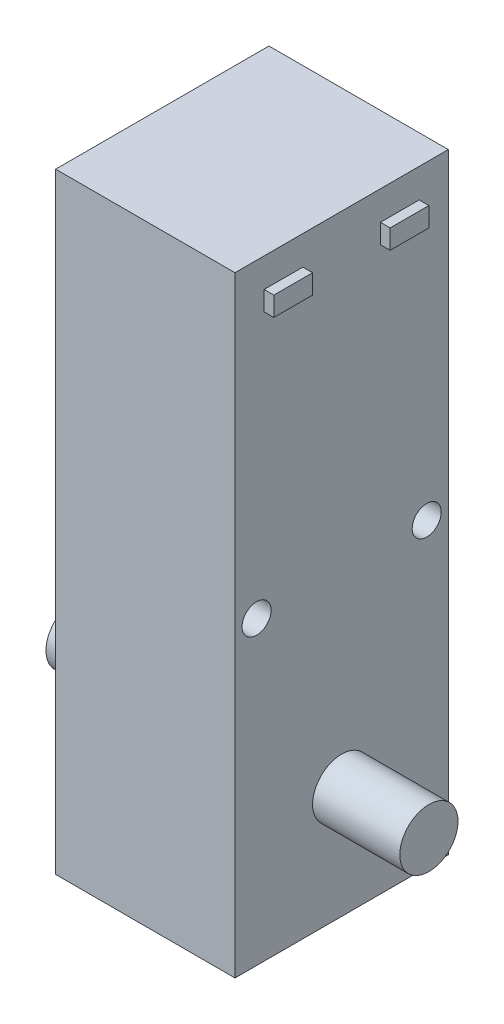
ISO-10303-21;
HEADER;
FILE_DESCRIPTION(('STEP AP214'),'2;1');
FILE_NAME('part.step','',(''),(''),'','','');
FILE_SCHEMA(('AUTOMOTIVE_DESIGN { 1 0 10303 214 1 1 1 1 }'));
ENDSEC;
DATA;
#1=APPLICATION_CONTEXT('core data for automotive mechanical design processes');
#2=APPLICATION_PROTOCOL_DEFINITION('international standard','automotive_design',2000,#1);
#3=PRODUCT_CONTEXT('',#1,'mechanical');
#4=PRODUCT('Part','Part','',(#3));
#5=PRODUCT_RELATED_PRODUCT_CATEGORY('part','',(#4));
#6=PRODUCT_DEFINITION_FORMATION('','',#4);
#7=PRODUCT_DEFINITION_CONTEXT('part definition',#1,'design');
#8=PRODUCT_DEFINITION('design','',#6,#7);
#9=PRODUCT_DEFINITION_SHAPE('','',#8);
#10=(LENGTH_UNIT() NAMED_UNIT(*) SI_UNIT(.MILLI.,.METRE.));
#11=(NAMED_UNIT(*) PLANE_ANGLE_UNIT() SI_UNIT($,.RADIAN.));
#12=(NAMED_UNIT(*) SI_UNIT($,.STERADIAN.) SOLID_ANGLE_UNIT());
#13=UNCERTAINTY_MEASURE_WITH_UNIT(LENGTH_MEASURE(1.E-05),#10,'distance_accuracy_value','');
#14=(GEOMETRIC_REPRESENTATION_CONTEXT(3) GLOBAL_UNCERTAINTY_ASSIGNED_CONTEXT((#13)) GLOBAL_UNIT_ASSIGNED_CONTEXT((#10,
#11,#12)) REPRESENTATION_CONTEXT('',''));
#15=CARTESIAN_POINT('',(0.,0.,0.));
#16=DIRECTION('',(0.,0.,1.));
#17=DIRECTION('',(1.,0.,0.));
#18=AXIS2_PLACEMENT_3D('',#15,#16,#17);
#19=CARTESIAN_POINT('',(18.5,0.,0.));
#20=DIRECTION('',(-1.,0.,0.));
#21=DIRECTION('',(0.,0.,1.));
#22=AXIS2_PLACEMENT_3D('',#19,#20,#21);
#23=PLANE('',#22);
#24=DIRECTION('',(0.,-1.,0.));
#25=VECTOR('',#24,1.);
#26=CARTESIAN_POINT('',(18.5,60.,-3.));
#27=LINE('',#26,#25);
#28=CARTESIAN_POINT('',(18.5,60.,-3.));
#29=VERTEX_POINT('',#28);
#30=CARTESIAN_POINT('',(18.5,58.,-3.));
#31=VERTEX_POINT('',#30);
#32=EDGE_CURVE('E143',#29,#31,#27,.T.);
#33=ORIENTED_EDGE('',*,*,#32,.F.);
#34=DIRECTION('',(0.,0.,1.));
#35=VECTOR('',#34,1.);
#36=CARTESIAN_POINT('',(18.5,60.,-3.));
#37=LINE('',#36,#35);
#38=CARTESIAN_POINT('',(18.5,60.,-7.));
#39=VERTEX_POINT('',#38);
#40=EDGE_CURVE('E156',#39,#29,#37,.T.);
#41=ORIENTED_EDGE('',*,*,#40,.F.);
#42=DIRECTION('',(0.,1.,0.));
#43=VECTOR('',#42,1.);
#44=CARTESIAN_POINT('',(18.5,60.,-7.));
#45=LINE('',#44,#43);
#46=CARTESIAN_POINT('',(18.5,58.,-7.));
#47=VERTEX_POINT('',#46);
#48=EDGE_CURVE('E165',#47,#39,#45,.T.);
#49=ORIENTED_EDGE('',*,*,#48,.F.);
#50=DIRECTION('',(0.,0.,-1.));
#51=VECTOR('',#50,1.);
#52=CARTESIAN_POINT('',(18.5,58.,-3.));
#53=LINE('',#52,#51);
#54=EDGE_CURVE('E146',#31,#47,#53,.T.);
#55=ORIENTED_EDGE('',*,*,#54,.F.);
#56=EDGE_LOOP('',(#33,#41,#49,#55));
#57=FACE_BOUND('',#56,.T.);
#58=CARTESIAN_POINT('',(18.5,11.5,-11.));
#59=DIRECTION('',(-1.,0.,0.));
#60=DIRECTION('',(0.,0.,1.));
#61=AXIS2_PLACEMENT_3D('',#58,#59,#60);
#62=CIRCLE('',#61,3.);
#63=CARTESIAN_POINT('',(18.5,11.5,-8.00000000000001));
#64=VERTEX_POINT('',#63);
#65=EDGE_CURVE('E187',#64,#64,#62,.T.);
#66=ORIENTED_EDGE('',*,*,#65,.T.);
#67=EDGE_LOOP('',(#66));
#68=FACE_BOUND('',#67,.T.);
#69=DIRECTION('',(0.,-1.,0.));
#70=VECTOR('',#69,1.);
#71=CARTESIAN_POINT('',(18.5,0.,0.));
#72=LINE('',#71,#70);
#73=CARTESIAN_POINT('',(18.5,63.,0.));
#74=VERTEX_POINT('',#73);
#75=CARTESIAN_POINT('',(18.5,0.,0.));
#76=VERTEX_POINT('',#75);
#77=EDGE_CURVE('E203',#74,#76,#72,.T.);
#78=ORIENTED_EDGE('',*,*,#77,.T.);
#79=DIRECTION('',(0.,0.,-1.));
#80=VECTOR('',#79,1.);
#81=CARTESIAN_POINT('',(18.5,0.,0.));
#82=LINE('',#81,#80);
#83=CARTESIAN_POINT('',(18.5,0.,-22.));
#84=VERTEX_POINT('',#83);
#85=EDGE_CURVE('E206',#76,#84,#82,.T.);
#86=ORIENTED_EDGE('',*,*,#85,.T.);
#87=DIRECTION('',(0.,1.,0.));
#88=VECTOR('',#87,1.);
#89=CARTESIAN_POINT('',(18.5,0.,-22.));
#90=LINE('',#89,#88);
#91=CARTESIAN_POINT('',(18.5,63.,-22.));
#92=VERTEX_POINT('',#91);
#93=EDGE_CURVE('E209',#84,#92,#90,.T.);
#94=ORIENTED_EDGE('',*,*,#93,.T.);
#95=DIRECTION('',(0.,0.,1.));
#96=VECTOR('',#95,1.);
#97=CARTESIAN_POINT('',(18.5,63.,0.));
#98=LINE('',#97,#96);
#99=EDGE_CURVE('E211',#92,#74,#98,.T.);
#100=ORIENTED_EDGE('',*,*,#99,.T.);
#101=EDGE_LOOP('',(#78,#86,#94,#100));
#102=FACE_BOUND('',#101,.T.);
#103=CARTESIAN_POINT('',(18.5,31.,-2.225));
#104=DIRECTION('',(1.,0.,0.));
#105=DIRECTION('',(0.,0.,-1.));
#106=AXIS2_PLACEMENT_3D('',#103,#104,#105);
#107=CIRCLE('',#106,1.5);
#108=CARTESIAN_POINT('',(18.5,31.,-3.725));
#109=VERTEX_POINT('',#108);
#110=EDGE_CURVE('E197',#109,#109,#107,.T.);
#111=ORIENTED_EDGE('',*,*,#110,.F.);
#112=EDGE_LOOP('',(#111));
#113=FACE_BOUND('',#112,.T.);
#114=CARTESIAN_POINT('',(18.5,31.,-19.775));
#115=DIRECTION('',(1.,0.,0.));
#116=DIRECTION('',(0.,0.,1.));
#117=AXIS2_PLACEMENT_3D('',#114,#115,#116);
#118=CIRCLE('',#117,1.5);
#119=CARTESIAN_POINT('',(18.5,31.,-18.275));
#120=VERTEX_POINT('',#119);
#121=EDGE_CURVE('E191',#120,#120,#118,.T.);
#122=ORIENTED_EDGE('',*,*,#121,.F.);
#123=EDGE_LOOP('',(#122));
#124=FACE_BOUND('',#123,.T.);
#125=DIRECTION('',(0.,1.,0.));
#126=VECTOR('',#125,1.);
#127=CARTESIAN_POINT('',(18.5,60.,-19.));
#128=LINE('',#127,#126);
#129=CARTESIAN_POINT('',(18.5,58.,-19.));
#130=VERTEX_POINT('',#129);
#131=CARTESIAN_POINT('',(18.5,60.,-19.));
#132=VERTEX_POINT('',#131);
#133=EDGE_CURVE('E142',#130,#132,#128,.T.);
#134=ORIENTED_EDGE('',*,*,#133,.F.);
#135=DIRECTION('',(0.,0.,-1.));
#136=VECTOR('',#135,1.);
#137=CARTESIAN_POINT('',(18.5,58.,-19.));
#138=LINE('',#137,#136);
#139=CARTESIAN_POINT('',(18.5,58.,-15.));
#140=VERTEX_POINT('',#139);
#141=EDGE_CURVE('E139',#140,#130,#138,.T.);
#142=ORIENTED_EDGE('',*,*,#141,.F.);
#143=DIRECTION('',(0.,-1.,0.));
#144=VECTOR('',#143,1.);
#145=CARTESIAN_POINT('',(18.5,60.,-15.));
#146=LINE('',#145,#144);
#147=CARTESIAN_POINT('',(18.5,60.,-15.));
#148=VERTEX_POINT('',#147);
#149=EDGE_CURVE('E53',#148,#140,#146,.T.);
#150=ORIENTED_EDGE('',*,*,#149,.F.);
#151=DIRECTION('',(0.,0.,1.));
#152=VECTOR('',#151,1.);
#153=CARTESIAN_POINT('',(18.5,60.,-19.));
#154=LINE('',#153,#152);
#155=EDGE_CURVE('E48',#132,#148,#154,.T.);
#156=ORIENTED_EDGE('',*,*,#155,.F.);
#157=EDGE_LOOP('',(#134,#142,#150,#156));
#158=FACE_BOUND('',#157,.T.);
#159=ADVANCED_FACE('F33',(#57,#68,#102,#113,#124,#158),#23,.F.);
#160=CARTESIAN_POINT('',(0.,0.,0.));
#161=DIRECTION('',(-1.,0.,0.));
#162=DIRECTION('',(0.,0.,1.));
#163=AXIS2_PLACEMENT_3D('',#160,#161,#162);
#164=PLANE('',#163);
#165=CARTESIAN_POINT('',(0.,11.5,-11.));
#166=DIRECTION('',(-1.,0.,0.));
#167=DIRECTION('',(0.,0.,1.));
#168=AXIS2_PLACEMENT_3D('',#165,#166,#167);
#169=CIRCLE('',#168,3.);
#170=CARTESIAN_POINT('',(0.,11.5,-8.00000000000001));
#171=VERTEX_POINT('',#170);
#172=EDGE_CURVE('E11',#171,#171,#169,.T.);
#173=ORIENTED_EDGE('',*,*,#172,.F.);
#174=EDGE_LOOP('',(#173));
#175=FACE_BOUND('',#174,.T.);
#176=CARTESIAN_POINT('',(0.,31.,-2.225));
#177=DIRECTION('',(1.,0.,0.));
#178=DIRECTION('',(0.,0.,-1.));
#179=AXIS2_PLACEMENT_3D('',#176,#177,#178);
#180=CIRCLE('',#179,1.5);
#181=CARTESIAN_POINT('',(0.,31.,-3.725));
#182=VERTEX_POINT('',#181);
#183=EDGE_CURVE('E194',#182,#182,#180,.T.);
#184=ORIENTED_EDGE('',*,*,#183,.T.);
#185=EDGE_LOOP('',(#184));
#186=FACE_BOUND('',#185,.T.);
#187=DIRECTION('',(0.,-1.,0.));
#188=VECTOR('',#187,1.);
#189=CARTESIAN_POINT('',(0.,0.,0.));
#190=LINE('',#189,#188);
#191=CARTESIAN_POINT('',(0.,63.,0.));
#192=VERTEX_POINT('',#191);
#193=CARTESIAN_POINT('',(0.,0.,0.));
#194=VERTEX_POINT('',#193);
#195=EDGE_CURVE('E200',#192,#194,#190,.T.);
#196=ORIENTED_EDGE('',*,*,#195,.F.);
#197=DIRECTION('',(0.,0.,1.));
#198=VECTOR('',#197,1.);
#199=CARTESIAN_POINT('',(0.,63.,0.));
#200=LINE('',#199,#198);
#201=CARTESIAN_POINT('',(0.,63.,-22.));
#202=VERTEX_POINT('',#201);
#203=EDGE_CURVE('E207',#202,#192,#200,.T.);
#204=ORIENTED_EDGE('',*,*,#203,.F.);
#205=DIRECTION('',(0.,1.,0.));
#206=VECTOR('',#205,1.);
#207=CARTESIAN_POINT('',(0.,0.,-22.));
#208=LINE('',#207,#206);
#209=CARTESIAN_POINT('',(0.,0.,-22.));
#210=VERTEX_POINT('',#209);
#211=EDGE_CURVE('E218',#210,#202,#208,.T.);
#212=ORIENTED_EDGE('',*,*,#211,.F.);
#213=DIRECTION('',(0.,0.,-1.));
#214=VECTOR('',#213,1.);
#215=CARTESIAN_POINT('',(0.,0.,0.));
#216=LINE('',#215,#214);
#217=EDGE_CURVE('E216',#194,#210,#216,.T.);
#218=ORIENTED_EDGE('',*,*,#217,.F.);
#219=EDGE_LOOP('',(#196,#204,#212,#218));
#220=FACE_BOUND('',#219,.T.);
#221=CARTESIAN_POINT('',(0.,31.,-19.775));
#222=DIRECTION('',(1.,0.,0.));
#223=DIRECTION('',(0.,0.,1.));
#224=AXIS2_PLACEMENT_3D('',#221,#222,#223);
#225=CIRCLE('',#224,1.5);
#226=CARTESIAN_POINT('',(0.,31.,-18.275));
#227=VERTEX_POINT('',#226);
#228=EDGE_CURVE('E190',#227,#227,#225,.T.);
#229=ORIENTED_EDGE('',*,*,#228,.T.);
#230=EDGE_LOOP('',(#229));
#231=FACE_BOUND('',#230,.T.);
#232=ADVANCED_FACE('F239',(#175,#186,#220,#231),#164,.T.);
#233=CARTESIAN_POINT('',(18.5,0.,0.));
#234=DIRECTION('',(0.,0.,-1.));
#235=DIRECTION('',(-1.,0.,0.));
#236=AXIS2_PLACEMENT_3D('',#233,#234,#235);
#237=PLANE('',#236);
#238=ORIENTED_EDGE('',*,*,#195,.T.);
#239=DIRECTION('',(-1.,0.,0.));
#240=VECTOR('',#239,1.);
#241=CARTESIAN_POINT('',(18.5,0.,0.));
#242=LINE('',#241,#240);
#243=EDGE_CURVE('E41',#76,#194,#242,.T.);
#244=ORIENTED_EDGE('',*,*,#243,.F.);
#245=ORIENTED_EDGE('',*,*,#77,.F.);
#246=DIRECTION('',(-1.,0.,0.));
#247=VECTOR('',#246,1.);
#248=CARTESIAN_POINT('',(18.5,63.,0.));
#249=LINE('',#248,#247);
#250=EDGE_CURVE('E213',#74,#192,#249,.T.);
#251=ORIENTED_EDGE('',*,*,#250,.T.);
#252=EDGE_LOOP('',(#238,#244,#245,#251));
#253=FACE_BOUND('',#252,.T.);
#254=ADVANCED_FACE('F35',(#253),#237,.F.);
#255=CARTESIAN_POINT('',(18.5,0.,0.));
#256=DIRECTION('',(0.,1.,0.));
#257=DIRECTION('',(0.,0.,1.));
#258=AXIS2_PLACEMENT_3D('',#255,#256,#257);
#259=PLANE('',#258);
#260=ORIENTED_EDGE('',*,*,#217,.T.);
#261=DIRECTION('',(-1.,0.,0.));
#262=VECTOR('',#261,1.);
#263=CARTESIAN_POINT('',(18.5,0.,-22.));
#264=LINE('',#263,#262);
#265=EDGE_CURVE('E226',#84,#210,#264,.T.);
#266=ORIENTED_EDGE('',*,*,#265,.F.);
#267=ORIENTED_EDGE('',*,*,#85,.F.);
#268=ORIENTED_EDGE('',*,*,#243,.T.);
#269=EDGE_LOOP('',(#260,#266,#267,#268));
#270=FACE_BOUND('',#269,.T.);
#271=ADVANCED_FACE('F231',(#270),#259,.F.);
#272=CARTESIAN_POINT('',(18.5,0.,-22.));
#273=DIRECTION('',(0.,0.,1.));
#274=DIRECTION('',(1.,0.,0.));
#275=AXIS2_PLACEMENT_3D('',#272,#273,#274);
#276=PLANE('',#275);
#277=ORIENTED_EDGE('',*,*,#211,.T.);
#278=DIRECTION('',(-1.,0.,0.));
#279=VECTOR('',#278,1.);
#280=CARTESIAN_POINT('',(18.5,63.,-22.));
#281=LINE('',#280,#279);
#282=EDGE_CURVE('E223',#92,#202,#281,.T.);
#283=ORIENTED_EDGE('',*,*,#282,.F.);
#284=ORIENTED_EDGE('',*,*,#93,.F.);
#285=ORIENTED_EDGE('',*,*,#265,.T.);
#286=EDGE_LOOP('',(#277,#283,#284,#285));
#287=FACE_BOUND('',#286,.T.);
#288=ADVANCED_FACE('F244',(#287),#276,.F.);
#289=CARTESIAN_POINT('',(18.5,63.,0.));
#290=DIRECTION('',(0.,-1.,0.));
#291=DIRECTION('',(0.,0.,-1.));
#292=AXIS2_PLACEMENT_3D('',#289,#290,#291);
#293=PLANE('',#292);
#294=ORIENTED_EDGE('',*,*,#203,.T.);
#295=ORIENTED_EDGE('',*,*,#250,.F.);
#296=ORIENTED_EDGE('',*,*,#99,.F.);
#297=ORIENTED_EDGE('',*,*,#282,.T.);
#298=EDGE_LOOP('',(#294,#295,#296,#297));
#299=FACE_BOUND('',#298,.T.);
#300=ADVANCED_FACE('F248',(#299),#293,.F.);
#301=CARTESIAN_POINT('',(18.5,31.,-2.225));
#302=DIRECTION('',(-1.,0.,0.));
#303=DIRECTION('',(0.,0.,1.));
#304=AXIS2_PLACEMENT_3D('',#301,#302,#303);
#305=CYLINDRICAL_SURFACE('',#304,1.5);
#306=ORIENTED_EDGE('',*,*,#110,.T.);
#307=EDGE_LOOP('',(#306));
#308=FACE_BOUND('',#307,.T.);
#309=ORIENTED_EDGE('',*,*,#183,.F.);
#310=EDGE_LOOP('',(#309));
#311=FACE_BOUND('',#310,.T.);
#312=ADVANCED_FACE('F320',(#308,#311),#305,.F.);
#313=CARTESIAN_POINT('',(18.5,31.,-19.775));
#314=DIRECTION('',(-1.,0.,0.));
#315=DIRECTION('',(0.,0.,1.));
#316=AXIS2_PLACEMENT_3D('',#313,#314,#315);
#317=CYLINDRICAL_SURFACE('',#316,1.5);
#318=ORIENTED_EDGE('',*,*,#121,.T.);
#319=EDGE_LOOP('',(#318));
#320=FACE_BOUND('',#319,.T.);
#321=ORIENTED_EDGE('',*,*,#228,.F.);
#322=EDGE_LOOP('',(#321));
#323=FACE_BOUND('',#322,.T.);
#324=ADVANCED_FACE('F313',(#320,#323),#317,.F.);
#325=CARTESIAN_POINT('',(-9.,11.5,-11.));
#326=DIRECTION('',(1.,0.,0.));
#327=DIRECTION('',(0.,0.,-1.));
#328=AXIS2_PLACEMENT_3D('',#325,#326,#327);
#329=PLANE('',#328);
#330=CARTESIAN_POINT('',(-9.,11.5,-11.));
#331=DIRECTION('',(1.,0.,0.));
#332=DIRECTION('',(0.,0.,-1.));
#333=AXIS2_PLACEMENT_3D('',#330,#331,#332);
#334=CIRCLE('',#333,3.);
#335=CARTESIAN_POINT('',(-9.,11.5,-14.));
#336=VERTEX_POINT('',#335);
#337=EDGE_CURVE('E184',#336,#336,#334,.T.);
#338=ORIENTED_EDGE('',*,*,#337,.F.);
#339=EDGE_LOOP('',(#338));
#340=FACE_BOUND('',#339,.T.);
#341=ADVANCED_FACE('F309',(#340),#329,.F.);
#342=CARTESIAN_POINT('',(-9.,11.5,-11.));
#343=DIRECTION('',(1.,0.,0.));
#344=DIRECTION('',(0.,0.,-1.));
#345=AXIS2_PLACEMENT_3D('',#342,#343,#344);
#346=CYLINDRICAL_SURFACE('',#345,3.);
#347=ORIENTED_EDGE('',*,*,#172,.T.);
#348=EDGE_LOOP('',(#347));
#349=FACE_BOUND('',#348,.T.);
#350=ORIENTED_EDGE('',*,*,#337,.T.);
#351=EDGE_LOOP('',(#350));
#352=FACE_BOUND('',#351,.T.);
#353=ADVANCED_FACE('F312',(#349,#352),#346,.T.);
#354=CARTESIAN_POINT('',(27.5,11.5,-11.));
#355=DIRECTION('',(1.,0.,0.));
#356=DIRECTION('',(0.,0.,-1.));
#357=AXIS2_PLACEMENT_3D('',#354,#355,#356);
#358=CIRCLE('',#357,3.);
#359=CARTESIAN_POINT('',(27.5,11.5,-14.));
#360=VERTEX_POINT('',#359);
#361=EDGE_CURVE('E181',#360,#360,#358,.T.);
#362=ORIENTED_EDGE('',*,*,#361,.F.);
#363=EDGE_LOOP('',(#362));
#364=FACE_BOUND('',#363,.T.);
#365=ORIENTED_EDGE('',*,*,#65,.F.);
#366=EDGE_LOOP('',(#365));
#367=FACE_BOUND('',#366,.T.);
#368=ADVANCED_FACE('F307',(#364,#367),#346,.T.);
#369=CARTESIAN_POINT('',(27.5,11.5,-11.));
#370=DIRECTION('',(1.,0.,0.));
#371=DIRECTION('',(0.,0.,-1.));
#372=AXIS2_PLACEMENT_3D('',#369,#370,#371);
#373=PLANE('',#372);
#374=ORIENTED_EDGE('',*,*,#361,.T.);
#375=EDGE_LOOP('',(#374));
#376=FACE_BOUND('',#375,.T.);
#377=ADVANCED_FACE('F303',(#376),#373,.T.);
#378=CARTESIAN_POINT('',(19.5,60.,-3.));
#379=DIRECTION('',(0.,0.,-1.));
#380=DIRECTION('',(0.,1.,0.));
#381=AXIS2_PLACEMENT_3D('',#378,#379,#380);
#382=PLANE('',#381);
#383=ORIENTED_EDGE('',*,*,#32,.T.);
#384=DIRECTION('',(-1.,0.,0.));
#385=VECTOR('',#384,1.);
#386=CARTESIAN_POINT('',(19.5,58.,-3.));
#387=LINE('',#386,#385);
#388=CARTESIAN_POINT('',(19.5,58.,-3.));
#389=VERTEX_POINT('',#388);
#390=EDGE_CURVE('E178',#389,#31,#387,.T.);
#391=ORIENTED_EDGE('',*,*,#390,.F.);
#392=DIRECTION('',(0.,-1.,0.));
#393=VECTOR('',#392,1.);
#394=CARTESIAN_POINT('',(19.5,60.,-3.));
#395=LINE('',#394,#393);
#396=CARTESIAN_POINT('',(19.5,60.,-3.));
#397=VERTEX_POINT('',#396);
#398=EDGE_CURVE('E152',#397,#389,#395,.T.);
#399=ORIENTED_EDGE('',*,*,#398,.F.);
#400=DIRECTION('',(-1.,0.,0.));
#401=VECTOR('',#400,1.);
#402=CARTESIAN_POINT('',(19.5,60.,-3.));
#403=LINE('',#402,#401);
#404=EDGE_CURVE('E161',#397,#29,#403,.T.);
#405=ORIENTED_EDGE('',*,*,#404,.T.);
#406=EDGE_LOOP('',(#383,#391,#399,#405));
#407=FACE_BOUND('',#406,.T.);
#408=ADVANCED_FACE('F299',(#407),#382,.F.);
#409=CARTESIAN_POINT('',(19.5,58.,-3.));
#410=DIRECTION('',(0.,1.,0.));
#411=DIRECTION('',(0.,0.,1.));
#412=AXIS2_PLACEMENT_3D('',#409,#410,#411);
#413=PLANE('',#412);
#414=ORIENTED_EDGE('',*,*,#54,.T.);
#415=DIRECTION('',(-1.,0.,0.));
#416=VECTOR('',#415,1.);
#417=CARTESIAN_POINT('',(19.5,58.,-7.));
#418=LINE('',#417,#416);
#419=CARTESIAN_POINT('',(19.5,58.,-7.));
#420=VERTEX_POINT('',#419);
#421=EDGE_CURVE('E175',#420,#47,#418,.T.);
#422=ORIENTED_EDGE('',*,*,#421,.F.);
#423=DIRECTION('',(0.,0.,-1.));
#424=VECTOR('',#423,1.);
#425=CARTESIAN_POINT('',(19.5,58.,-3.));
#426=LINE('',#425,#424);
#427=EDGE_CURVE('E155',#389,#420,#426,.T.);
#428=ORIENTED_EDGE('',*,*,#427,.F.);
#429=ORIENTED_EDGE('',*,*,#390,.T.);
#430=EDGE_LOOP('',(#414,#422,#428,#429));
#431=FACE_BOUND('',#430,.T.);
#432=ADVANCED_FACE('F295',(#431),#413,.F.);
#433=CARTESIAN_POINT('',(19.5,60.,-7.));
#434=DIRECTION('',(0.,0.,1.));
#435=DIRECTION('',(1.,0.,0.));
#436=AXIS2_PLACEMENT_3D('',#433,#434,#435);
#437=PLANE('',#436);
#438=ORIENTED_EDGE('',*,*,#48,.T.);
#439=DIRECTION('',(-1.,0.,0.));
#440=VECTOR('',#439,1.);
#441=CARTESIAN_POINT('',(19.5,60.,-7.));
#442=LINE('',#441,#440);
#443=CARTESIAN_POINT('',(19.5,60.,-7.));
#444=VERTEX_POINT('',#443);
#445=EDGE_CURVE('E172',#444,#39,#442,.T.);
#446=ORIENTED_EDGE('',*,*,#445,.F.);
#447=DIRECTION('',(0.,1.,0.));
#448=VECTOR('',#447,1.);
#449=CARTESIAN_POINT('',(19.5,60.,-7.));
#450=LINE('',#449,#448);
#451=EDGE_CURVE('E158',#420,#444,#450,.T.);
#452=ORIENTED_EDGE('',*,*,#451,.F.);
#453=ORIENTED_EDGE('',*,*,#421,.T.);
#454=EDGE_LOOP('',(#438,#446,#452,#453));
#455=FACE_BOUND('',#454,.T.);
#456=ADVANCED_FACE('F291',(#455),#437,.F.);
#457=CARTESIAN_POINT('',(19.5,60.,-3.));
#458=DIRECTION('',(0.,-1.,0.));
#459=DIRECTION('',(0.,0.,-1.));
#460=AXIS2_PLACEMENT_3D('',#457,#458,#459);
#461=PLANE('',#460);
#462=ORIENTED_EDGE('',*,*,#40,.T.);
#463=ORIENTED_EDGE('',*,*,#404,.F.);
#464=DIRECTION('',(0.,0.,1.));
#465=VECTOR('',#464,1.);
#466=CARTESIAN_POINT('',(19.5,60.,-3.));
#467=LINE('',#466,#465);
#468=EDGE_CURVE('E160',#444,#397,#467,.T.);
#469=ORIENTED_EDGE('',*,*,#468,.F.);
#470=ORIENTED_EDGE('',*,*,#445,.T.);
#471=EDGE_LOOP('',(#462,#463,#469,#470));
#472=FACE_BOUND('',#471,.T.);
#473=ADVANCED_FACE('F287',(#472),#461,.F.);
#474=CARTESIAN_POINT('',(19.5,0.,0.));
#475=DIRECTION('',(1.,0.,0.));
#476=DIRECTION('',(0.,0.,-1.));
#477=AXIS2_PLACEMENT_3D('',#474,#475,#476);
#478=PLANE('',#477);
#479=ORIENTED_EDGE('',*,*,#398,.T.);
#480=ORIENTED_EDGE('',*,*,#427,.T.);
#481=ORIENTED_EDGE('',*,*,#451,.T.);
#482=ORIENTED_EDGE('',*,*,#468,.T.);
#483=EDGE_LOOP('',(#479,#480,#481,#482));
#484=FACE_BOUND('',#483,.T.);
#485=ADVANCED_FACE('F284',(#484),#478,.T.);
#486=CARTESIAN_POINT('',(19.5,60.,-19.));
#487=DIRECTION('',(0.,0.,1.));
#488=DIRECTION('',(1.,0.,0.));
#489=AXIS2_PLACEMENT_3D('',#486,#487,#488);
#490=PLANE('',#489);
#491=ORIENTED_EDGE('',*,*,#133,.T.);
#492=DIRECTION('',(-1.,0.,0.));
#493=VECTOR('',#492,1.);
#494=CARTESIAN_POINT('',(19.5,60.,-19.));
#495=LINE('',#494,#493);
#496=CARTESIAN_POINT('',(19.5,60.,-19.));
#497=VERTEX_POINT('',#496);
#498=EDGE_CURVE('E123',#497,#132,#495,.T.);
#499=ORIENTED_EDGE('',*,*,#498,.F.);
#500=DIRECTION('',(0.,1.,0.));
#501=VECTOR('',#500,1.);
#502=CARTESIAN_POINT('',(19.5,60.,-19.));
#503=LINE('',#502,#501);
#504=CARTESIAN_POINT('',(19.5,58.,-19.));
#505=VERTEX_POINT('',#504);
#506=EDGE_CURVE('E130',#505,#497,#503,.T.);
#507=ORIENTED_EDGE('',*,*,#506,.F.);
#508=DIRECTION('',(-1.,0.,0.));
#509=VECTOR('',#508,1.);
#510=CARTESIAN_POINT('',(19.5,58.,-19.));
#511=LINE('',#510,#509);
#512=EDGE_CURVE('E262',#505,#130,#511,.T.);
#513=ORIENTED_EDGE('',*,*,#512,.T.);
#514=EDGE_LOOP('',(#491,#499,#507,#513));
#515=FACE_BOUND('',#514,.T.);
#516=ADVANCED_FACE('F141',(#515),#490,.F.);
#517=CARTESIAN_POINT('',(19.5,60.,-19.));
#518=DIRECTION('',(0.,-1.,0.));
#519=DIRECTION('',(0.,0.,-1.));
#520=AXIS2_PLACEMENT_3D('',#517,#518,#519);
#521=PLANE('',#520);
#522=ORIENTED_EDGE('',*,*,#155,.T.);
#523=DIRECTION('',(-1.,0.,0.));
#524=VECTOR('',#523,1.);
#525=CARTESIAN_POINT('',(19.5,60.,-15.));
#526=LINE('',#525,#524);
#527=CARTESIAN_POINT('',(19.5,60.,-15.));
#528=VERTEX_POINT('',#527);
#529=EDGE_CURVE('E126',#528,#148,#526,.T.);
#530=ORIENTED_EDGE('',*,*,#529,.F.);
#531=DIRECTION('',(0.,0.,1.));
#532=VECTOR('',#531,1.);
#533=CARTESIAN_POINT('',(19.5,60.,-19.));
#534=LINE('',#533,#532);
#535=EDGE_CURVE('E119',#497,#528,#534,.T.);
#536=ORIENTED_EDGE('',*,*,#535,.F.);
#537=ORIENTED_EDGE('',*,*,#498,.T.);
#538=EDGE_LOOP('',(#522,#530,#536,#537));
#539=FACE_BOUND('',#538,.T.);
#540=ADVANCED_FACE('F121',(#539),#521,.F.);
#541=CARTESIAN_POINT('',(19.5,60.,-15.));
#542=DIRECTION('',(0.,0.,-1.));
#543=DIRECTION('',(-1.,0.,0.));
#544=AXIS2_PLACEMENT_3D('',#541,#542,#543);
#545=PLANE('',#544);
#546=ORIENTED_EDGE('',*,*,#149,.T.);
#547=DIRECTION('',(-1.,0.,0.));
#548=VECTOR('',#547,1.);
#549=CARTESIAN_POINT('',(19.5,58.,-15.));
#550=LINE('',#549,#548);
#551=CARTESIAN_POINT('',(19.5,58.,-15.));
#552=VERTEX_POINT('',#551);
#553=EDGE_CURVE('E148',#552,#140,#550,.T.);
#554=ORIENTED_EDGE('',*,*,#553,.F.);
#555=DIRECTION('',(0.,-1.,0.));
#556=VECTOR('',#555,1.);
#557=CARTESIAN_POINT('',(19.5,60.,-15.));
#558=LINE('',#557,#556);
#559=EDGE_CURVE('E129',#528,#552,#558,.T.);
#560=ORIENTED_EDGE('',*,*,#559,.F.);
#561=ORIENTED_EDGE('',*,*,#529,.T.);
#562=EDGE_LOOP('',(#546,#554,#560,#561));
#563=FACE_BOUND('',#562,.T.);
#564=ADVANCED_FACE('F271',(#563),#545,.F.);
#565=CARTESIAN_POINT('',(19.5,58.,-19.));
#566=DIRECTION('',(0.,1.,0.));
#567=DIRECTION('',(0.,0.,1.));
#568=AXIS2_PLACEMENT_3D('',#565,#566,#567);
#569=PLANE('',#568);
#570=ORIENTED_EDGE('',*,*,#141,.T.);
#571=ORIENTED_EDGE('',*,*,#512,.F.);
#572=DIRECTION('',(0.,0.,-1.));
#573=VECTOR('',#572,1.);
#574=CARTESIAN_POINT('',(19.5,58.,-19.));
#575=LINE('',#574,#573);
#576=EDGE_CURVE('E135',#552,#505,#575,.T.);
#577=ORIENTED_EDGE('',*,*,#576,.F.);
#578=ORIENTED_EDGE('',*,*,#553,.T.);
#579=EDGE_LOOP('',(#570,#571,#577,#578));
#580=FACE_BOUND('',#579,.T.);
#581=ADVANCED_FACE('F261',(#580),#569,.F.);
#582=CARTESIAN_POINT('',(19.5,0.,0.));
#583=DIRECTION('',(-1.,0.,0.));
#584=DIRECTION('',(0.,0.,1.));
#585=AXIS2_PLACEMENT_3D('',#582,#583,#584);
#586=PLANE('',#585);
#587=ORIENTED_EDGE('',*,*,#506,.T.);
#588=ORIENTED_EDGE('',*,*,#535,.T.);
#589=ORIENTED_EDGE('',*,*,#559,.T.);
#590=ORIENTED_EDGE('',*,*,#576,.T.);
#591=EDGE_LOOP('',(#587,#588,#589,#590));
#592=FACE_BOUND('',#591,.T.);
#593=ADVANCED_FACE('F133',(#592),#586,.F.);
#594=CLOSED_SHELL('',(#159,#232,#254,#271,#288,#300,#312,#324,#341,#353,#368,#377,#408,#432,
#456,#473,#485,#516,#540,#564,#581,#593));
#595=MANIFOLD_SOLID_BREP('B2',#594);
#596=ADVANCED_BREP_SHAPE_REPRESENTATION('',(#18,#595),#14);
#597=SHAPE_DEFINITION_REPRESENTATION(#9,#596);
ENDSEC;
END-ISO-10303-21;
